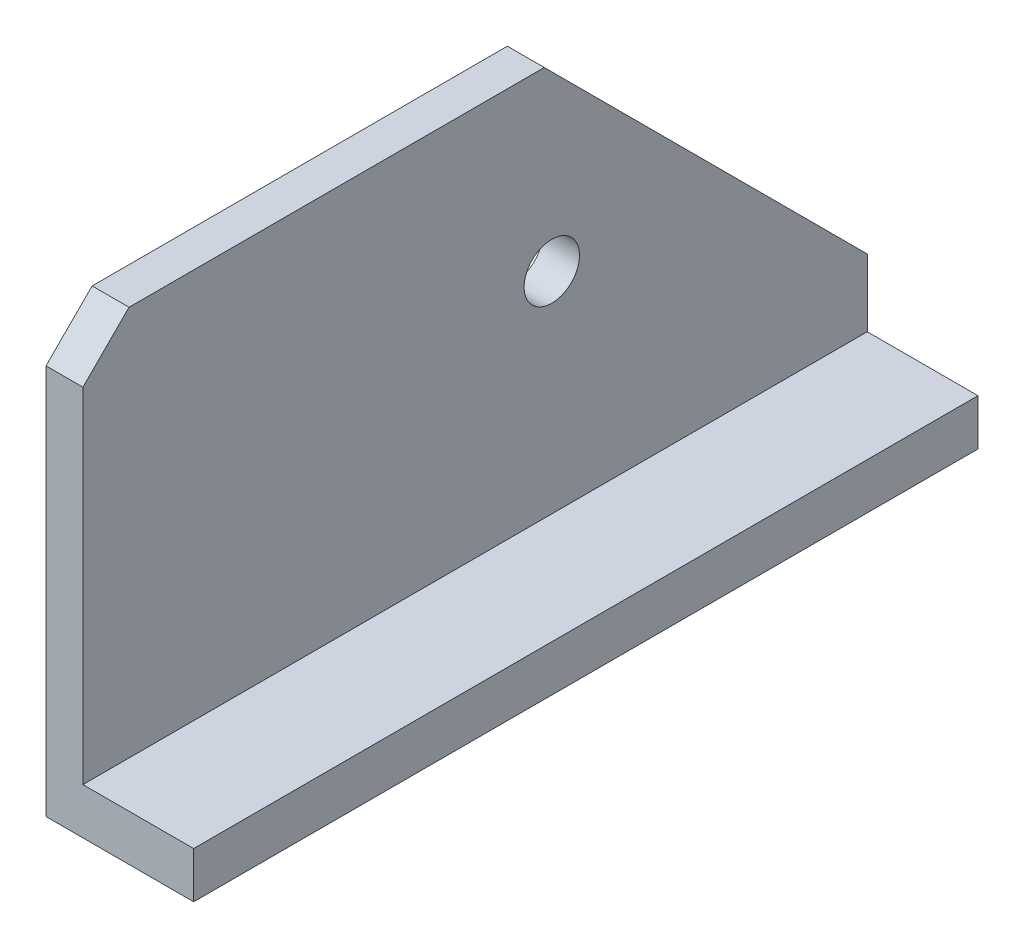
ISO-10303-21;
HEADER;
FILE_DESCRIPTION(('STEP AP214'),'2;1');
FILE_NAME('part.step','',(''),(''),'','','');
FILE_SCHEMA(('AUTOMOTIVE_DESIGN { 1 0 10303 214 1 1 1 1 }'));
ENDSEC;
DATA;
#1=APPLICATION_CONTEXT('core data for automotive mechanical design processes');
#2=APPLICATION_PROTOCOL_DEFINITION('international standard','automotive_design',2000,#1);
#3=PRODUCT_CONTEXT('',#1,'mechanical');
#4=PRODUCT('Part','Part','',(#3));
#5=PRODUCT_RELATED_PRODUCT_CATEGORY('part','',(#4));
#6=PRODUCT_DEFINITION_FORMATION('','',#4);
#7=PRODUCT_DEFINITION_CONTEXT('part definition',#1,'design');
#8=PRODUCT_DEFINITION('design','',#6,#7);
#9=PRODUCT_DEFINITION_SHAPE('','',#8);
#10=(LENGTH_UNIT() NAMED_UNIT(*) SI_UNIT(.MILLI.,.METRE.));
#11=(NAMED_UNIT(*) PLANE_ANGLE_UNIT() SI_UNIT($,.RADIAN.));
#12=(NAMED_UNIT(*) SI_UNIT($,.STERADIAN.) SOLID_ANGLE_UNIT());
#13=UNCERTAINTY_MEASURE_WITH_UNIT(LENGTH_MEASURE(1.E-05),#10,'distance_accuracy_value','');
#14=(GEOMETRIC_REPRESENTATION_CONTEXT(3) GLOBAL_UNCERTAINTY_ASSIGNED_CONTEXT((#13)) GLOBAL_UNIT_ASSIGNED_CONTEXT((#10,
#11,#12)) REPRESENTATION_CONTEXT('',''));
#15=CARTESIAN_POINT('',(0.,0.,0.));
#16=DIRECTION('',(0.,0.,1.));
#17=DIRECTION('',(1.,0.,0.));
#18=AXIS2_PLACEMENT_3D('',#15,#16,#17);
#19=CARTESIAN_POINT('',(0.,0.,85.));
#20=DIRECTION('',(-1.,0.,0.));
#21=DIRECTION('',(0.,0.,1.));
#22=AXIS2_PLACEMENT_3D('',#19,#20,#21);
#23=PLANE('',#22);
#24=CARTESIAN_POINT('',(0.,22.7734272365414,34.1865307648012));
#25=DIRECTION('',(1.,0.,0.));
#26=DIRECTION('',(0.,0.,-1.));
#27=AXIS2_PLACEMENT_3D('',#24,#25,#26);
#28=CIRCLE('',#27,2.99999999999942);
#29=CARTESIAN_POINT('',(0.,22.7734272365414,31.1865307648018));
#30=VERTEX_POINT('',#29);
#31=EDGE_CURVE('E171',#30,#30,#28,.T.);
#32=ORIENTED_EDGE('',*,*,#31,.F.);
#33=EDGE_LOOP('',(#32));
#34=FACE_BOUND('',#33,.T.);
#35=DIRECTION('',(0.,0.,-1.));
#36=VECTOR('',#35,1.);
#37=CARTESIAN_POINT('',(0.,42.3000000000002,85.));
#38=LINE('',#37,#36);
#39=CARTESIAN_POINT('',(0.,42.3000000000002,80.));
#40=VERTEX_POINT('',#39);
#41=CARTESIAN_POINT('',(0.,42.3000000000002,35.));
#42=VERTEX_POINT('',#41);
#43=EDGE_CURVE('E143',#40,#42,#38,.T.);
#44=ORIENTED_EDGE('',*,*,#43,.F.);
#45=DIRECTION('',(0.,-0.707106781186547,0.707106781186549));
#46=VECTOR('',#45,1.);
#47=CARTESIAN_POINT('',(0.,37.3000000000003,85.));
#48=LINE('',#47,#46);
#49=CARTESIAN_POINT('',(0.,37.3000000000003,85.));
#50=VERTEX_POINT('',#49);
#51=EDGE_CURVE('E11',#40,#50,#48,.T.);
#52=ORIENTED_EDGE('',*,*,#51,.T.);
#53=DIRECTION('',(0.,1.,0.));
#54=VECTOR('',#53,1.);
#55=CARTESIAN_POINT('',(0.,0.,85.));
#56=LINE('',#55,#54);
#57=CARTESIAN_POINT('',(0.,0.,85.));
#58=VERTEX_POINT('',#57);
#59=EDGE_CURVE('E102',#58,#50,#56,.T.);
#60=ORIENTED_EDGE('',*,*,#59,.F.);
#61=DIRECTION('',(0.,0.,-1.));
#62=VECTOR('',#61,1.);
#63=CARTESIAN_POINT('',(0.,0.,85.));
#64=LINE('',#63,#62);
#65=CARTESIAN_POINT('',(0.,0.,0.));
#66=VERTEX_POINT('',#65);
#67=EDGE_CURVE('E124',#58,#66,#64,.T.);
#68=ORIENTED_EDGE('',*,*,#67,.T.);
#69=DIRECTION('',(0.,1.,0.));
#70=VECTOR('',#69,1.);
#71=CARTESIAN_POINT('',(0.,0.,0.));
#72=LINE('',#71,#70);
#73=CARTESIAN_POINT('',(0.,7.30000000000015,0.));
#74=VERTEX_POINT('',#73);
#75=EDGE_CURVE('E125',#66,#74,#72,.T.);
#76=ORIENTED_EDGE('',*,*,#75,.T.);
#77=DIRECTION('',(0.,-0.707106781186548,-0.707106781186547));
#78=VECTOR('',#77,1.);
#79=CARTESIAN_POINT('',(0.,42.3000000000002,35.));
#80=LINE('',#79,#78);
#81=EDGE_CURVE('E152',#74,#42,#80,.F.);
#82=ORIENTED_EDGE('',*,*,#81,.T.);
#83=EDGE_LOOP('',(#44,#52,#60,#68,#76,#82));
#84=FACE_BOUND('',#83,.T.);
#85=ADVANCED_FACE('F31',(#34,#84),#23,.F.);
#86=CARTESIAN_POINT('',(0.,42.3000000000002,85.));
#87=DIRECTION('',(0.,-1.,0.));
#88=DIRECTION('',(0.,0.,-1.));
#89=AXIS2_PLACEMENT_3D('',#86,#87,#88);
#90=PLANE('',#89);
#91=DIRECTION('',(0.,0.,-1.));
#92=VECTOR('',#91,1.);
#93=CARTESIAN_POINT('',(-4.,42.3000000000002,85.));
#94=LINE('',#93,#92);
#95=CARTESIAN_POINT('',(-4.,42.3000000000002,80.));
#96=VERTEX_POINT('',#95);
#97=CARTESIAN_POINT('',(-4.,42.3000000000002,35.));
#98=VERTEX_POINT('',#97);
#99=EDGE_CURVE('E111',#96,#98,#94,.T.);
#100=ORIENTED_EDGE('',*,*,#99,.F.);
#101=DIRECTION('',(1.,0.,0.));
#102=VECTOR('',#101,1.);
#103=CARTESIAN_POINT('',(0.,42.3000000000002,80.));
#104=LINE('',#103,#102);
#105=EDGE_CURVE('E39',#96,#40,#104,.T.);
#106=ORIENTED_EDGE('',*,*,#105,.T.);
#107=ORIENTED_EDGE('',*,*,#43,.T.);
#108=DIRECTION('',(-1.,0.,0.));
#109=VECTOR('',#108,1.);
#110=CARTESIAN_POINT('',(0.,42.3000000000002,35.));
#111=LINE('',#110,#109);
#112=EDGE_CURVE('E145',#42,#98,#111,.T.);
#113=ORIENTED_EDGE('',*,*,#112,.T.);
#114=EDGE_LOOP('',(#100,#106,#107,#113));
#115=FACE_BOUND('',#114,.T.);
#116=ADVANCED_FACE('F165',(#115),#90,.F.);
#117=CARTESIAN_POINT('',(-4.,-5.,85.));
#118=DIRECTION('',(1.,0.,0.));
#119=DIRECTION('',(0.,0.,-1.));
#120=AXIS2_PLACEMENT_3D('',#117,#118,#119);
#121=PLANE('',#120);
#122=CARTESIAN_POINT('',(-4.,22.7734272365414,34.1865307648012));
#123=DIRECTION('',(1.,0.,0.));
#124=DIRECTION('',(0.,0.,-1.));
#125=AXIS2_PLACEMENT_3D('',#122,#123,#124);
#126=CIRCLE('',#125,2.99999999999942);
#127=CARTESIAN_POINT('',(-4.,22.7734272365414,31.1865307648018));
#128=VERTEX_POINT('',#127);
#129=EDGE_CURVE('E128',#128,#128,#126,.T.);
#130=ORIENTED_EDGE('',*,*,#129,.T.);
#131=EDGE_LOOP('',(#130));
#132=FACE_BOUND('',#131,.T.);
#133=DIRECTION('',(0.,-1.,0.));
#134=VECTOR('',#133,1.);
#135=CARTESIAN_POINT('',(-4.,-5.,85.));
#136=LINE('',#135,#134);
#137=CARTESIAN_POINT('',(-4.,37.3000000000003,85.));
#138=VERTEX_POINT('',#137);
#139=CARTESIAN_POINT('',(-4.,-5.,85.));
#140=VERTEX_POINT('',#139);
#141=EDGE_CURVE('E93',#138,#140,#136,.T.);
#142=ORIENTED_EDGE('',*,*,#141,.F.);
#143=DIRECTION('',(0.,0.707106781186547,-0.707106781186549));
#144=VECTOR('',#143,1.);
#145=CARTESIAN_POINT('',(-4.,37.3000000000003,85.));
#146=LINE('',#145,#144);
#147=EDGE_CURVE('E53',#138,#96,#146,.T.);
#148=ORIENTED_EDGE('',*,*,#147,.T.);
#149=ORIENTED_EDGE('',*,*,#99,.T.);
#150=DIRECTION('',(0.,0.707106781186548,0.707106781186547));
#151=VECTOR('',#150,1.);
#152=CARTESIAN_POINT('',(-4.,42.3000000000002,35.));
#153=LINE('',#152,#151);
#154=CARTESIAN_POINT('',(-4.,7.30000000000015,0.));
#155=VERTEX_POINT('',#154);
#156=EDGE_CURVE('E148',#98,#155,#153,.F.);
#157=ORIENTED_EDGE('',*,*,#156,.T.);
#158=DIRECTION('',(0.,-1.,0.));
#159=VECTOR('',#158,1.);
#160=CARTESIAN_POINT('',(-4.,-5.,0.));
#161=LINE('',#160,#159);
#162=CARTESIAN_POINT('',(-4.,-5.,0.));
#163=VERTEX_POINT('',#162);
#164=EDGE_CURVE('E108',#155,#163,#161,.T.);
#165=ORIENTED_EDGE('',*,*,#164,.T.);
#166=DIRECTION('',(0.,0.,-1.));
#167=VECTOR('',#166,1.);
#168=CARTESIAN_POINT('',(-4.,-5.,85.));
#169=LINE('',#168,#167);
#170=EDGE_CURVE('E105',#140,#163,#169,.T.);
#171=ORIENTED_EDGE('',*,*,#170,.F.);
#172=EDGE_LOOP('',(#142,#148,#149,#157,#165,#171));
#173=FACE_BOUND('',#172,.T.);
#174=ADVANCED_FACE('F106',(#132,#173),#121,.F.);
#175=CARTESIAN_POINT('',(-4.,-5.,85.));
#176=DIRECTION('',(0.,1.,0.));
#177=DIRECTION('',(0.,0.,1.));
#178=AXIS2_PLACEMENT_3D('',#175,#176,#177);
#179=PLANE('',#178);
#180=DIRECTION('',(1.,0.,0.));
#181=VECTOR('',#180,1.);
#182=CARTESIAN_POINT('',(-4.,-5.,0.));
#183=LINE('',#182,#181);
#184=CARTESIAN_POINT('',(12.,-5.,0.));
#185=VERTEX_POINT('',#184);
#186=EDGE_CURVE('E130',#163,#185,#183,.T.);
#187=ORIENTED_EDGE('',*,*,#186,.T.);
#188=DIRECTION('',(0.,0.,-1.));
#189=VECTOR('',#188,1.);
#190=CARTESIAN_POINT('',(12.,-5.,85.));
#191=LINE('',#190,#189);
#192=CARTESIAN_POINT('',(12.,-5.,85.));
#193=VERTEX_POINT('',#192);
#194=EDGE_CURVE('E112',#193,#185,#191,.T.);
#195=ORIENTED_EDGE('',*,*,#194,.F.);
#196=DIRECTION('',(1.,0.,0.));
#197=VECTOR('',#196,1.);
#198=CARTESIAN_POINT('',(-4.,-5.,85.));
#199=LINE('',#198,#197);
#200=EDGE_CURVE('E98',#140,#193,#199,.T.);
#201=ORIENTED_EDGE('',*,*,#200,.F.);
#202=ORIENTED_EDGE('',*,*,#170,.T.);
#203=EDGE_LOOP('',(#187,#195,#201,#202));
#204=FACE_BOUND('',#203,.T.);
#205=ADVANCED_FACE('F114',(#204),#179,.F.);
#206=CARTESIAN_POINT('',(12.,0.,85.));
#207=DIRECTION('',(-1.,0.,0.));
#208=DIRECTION('',(0.,0.,1.));
#209=AXIS2_PLACEMENT_3D('',#206,#207,#208);
#210=PLANE('',#209);
#211=DIRECTION('',(0.,1.,0.));
#212=VECTOR('',#211,1.);
#213=CARTESIAN_POINT('',(12.,0.,0.));
#214=LINE('',#213,#212);
#215=CARTESIAN_POINT('',(12.,0.,0.));
#216=VERTEX_POINT('',#215);
#217=EDGE_CURVE('E132',#185,#216,#214,.T.);
#218=ORIENTED_EDGE('',*,*,#217,.T.);
#219=DIRECTION('',(0.,0.,-1.));
#220=VECTOR('',#219,1.);
#221=CARTESIAN_POINT('',(12.,0.,85.));
#222=LINE('',#221,#220);
#223=CARTESIAN_POINT('',(12.,0.,85.));
#224=VERTEX_POINT('',#223);
#225=EDGE_CURVE('E138',#224,#216,#222,.T.);
#226=ORIENTED_EDGE('',*,*,#225,.F.);
#227=DIRECTION('',(0.,1.,0.));
#228=VECTOR('',#227,1.);
#229=CARTESIAN_POINT('',(12.,0.,85.));
#230=LINE('',#229,#228);
#231=EDGE_CURVE('E117',#193,#224,#230,.T.);
#232=ORIENTED_EDGE('',*,*,#231,.F.);
#233=ORIENTED_EDGE('',*,*,#194,.T.);
#234=EDGE_LOOP('',(#218,#226,#232,#233));
#235=FACE_BOUND('',#234,.T.);
#236=ADVANCED_FACE('F254',(#235),#210,.F.);
#237=CARTESIAN_POINT('',(0.,0.,85.));
#238=DIRECTION('',(0.,-1.,0.));
#239=DIRECTION('',(0.,0.,-1.));
#240=AXIS2_PLACEMENT_3D('',#237,#238,#239);
#241=PLANE('',#240);
#242=DIRECTION('',(-1.,0.,0.));
#243=VECTOR('',#242,1.);
#244=CARTESIAN_POINT('',(0.,0.,0.));
#245=LINE('',#244,#243);
#246=EDGE_CURVE('E134',#216,#66,#245,.T.);
#247=ORIENTED_EDGE('',*,*,#246,.T.);
#248=ORIENTED_EDGE('',*,*,#67,.F.);
#249=DIRECTION('',(-1.,0.,0.));
#250=VECTOR('',#249,1.);
#251=CARTESIAN_POINT('',(0.,0.,85.));
#252=LINE('',#251,#250);
#253=EDGE_CURVE('E119',#224,#58,#252,.T.);
#254=ORIENTED_EDGE('',*,*,#253,.F.);
#255=ORIENTED_EDGE('',*,*,#225,.T.);
#256=EDGE_LOOP('',(#247,#248,#254,#255));
#257=FACE_BOUND('',#256,.T.);
#258=ADVANCED_FACE('F208',(#257),#241,.F.);
#259=CARTESIAN_POINT('',(0.,42.3000000000002,85.));
#260=DIRECTION('',(0.,0.,1.));
#261=DIRECTION('',(1.,0.,0.));
#262=AXIS2_PLACEMENT_3D('',#259,#260,#261);
#263=PLANE('',#262);
#264=ORIENTED_EDGE('',*,*,#59,.T.);
#265=DIRECTION('',(-1.,0.,0.));
#266=VECTOR('',#265,1.);
#267=CARTESIAN_POINT('',(-4.,37.3000000000003,85.));
#268=LINE('',#267,#266);
#269=EDGE_CURVE('E101',#50,#138,#268,.T.);
#270=ORIENTED_EDGE('',*,*,#269,.T.);
#271=ORIENTED_EDGE('',*,*,#141,.T.);
#272=ORIENTED_EDGE('',*,*,#200,.T.);
#273=ORIENTED_EDGE('',*,*,#231,.T.);
#274=ORIENTED_EDGE('',*,*,#253,.T.);
#275=EDGE_LOOP('',(#264,#270,#271,#272,#273,#274));
#276=FACE_BOUND('',#275,.T.);
#277=ADVANCED_FACE('F96',(#276),#263,.T.);
#278=CARTESIAN_POINT('',(0.,42.3000000000002,0.));
#279=DIRECTION('',(0.,0.,1.));
#280=DIRECTION('',(1.,0.,0.));
#281=AXIS2_PLACEMENT_3D('',#278,#279,#280);
#282=PLANE('',#281);
#283=ORIENTED_EDGE('',*,*,#164,.F.);
#284=DIRECTION('',(1.,0.,0.));
#285=VECTOR('',#284,1.);
#286=CARTESIAN_POINT('',(0.,7.30000000000015,0.));
#287=LINE('',#286,#285);
#288=EDGE_CURVE('E150',#155,#74,#287,.T.);
#289=ORIENTED_EDGE('',*,*,#288,.T.);
#290=ORIENTED_EDGE('',*,*,#75,.F.);
#291=ORIENTED_EDGE('',*,*,#246,.F.);
#292=ORIENTED_EDGE('',*,*,#217,.F.);
#293=ORIENTED_EDGE('',*,*,#186,.F.);
#294=EDGE_LOOP('',(#283,#289,#290,#291,#292,#293));
#295=FACE_BOUND('',#294,.T.);
#296=ADVANCED_FACE('F181',(#295),#282,.F.);
#297=CARTESIAN_POINT('',(-4.,22.7734272365414,34.1865307648012));
#298=DIRECTION('',(1.,0.,0.));
#299=DIRECTION('',(0.,0.,-1.));
#300=AXIS2_PLACEMENT_3D('',#297,#298,#299);
#301=CYLINDRICAL_SURFACE('',#300,2.99999999999942);
#302=ORIENTED_EDGE('',*,*,#129,.F.);
#303=EDGE_LOOP('',(#302));
#304=FACE_BOUND('',#303,.T.);
#305=ORIENTED_EDGE('',*,*,#31,.T.);
#306=EDGE_LOOP('',(#305));
#307=FACE_BOUND('',#306,.T.);
#308=ADVANCED_FACE('F178',(#304,#307),#301,.F.);
#309=CARTESIAN_POINT('',(0.,42.3000000000002,35.));
#310=DIRECTION('',(0.,-0.707106781186547,0.707106781186548));
#311=DIRECTION('',(0.,-0.707106781186548,-0.707106781186547));
#312=AXIS2_PLACEMENT_3D('',#309,#310,#311);
#313=PLANE('',#312);
#314=ORIENTED_EDGE('',*,*,#81,.F.);
#315=ORIENTED_EDGE('',*,*,#288,.F.);
#316=ORIENTED_EDGE('',*,*,#156,.F.);
#317=ORIENTED_EDGE('',*,*,#112,.F.);
#318=EDGE_LOOP('',(#314,#315,#316,#317));
#319=FACE_BOUND('',#318,.T.);
#320=ADVANCED_FACE('F164',(#319),#313,.F.);
#321=CARTESIAN_POINT('',(0.,37.3000000000003,85.));
#322=DIRECTION('',(0.,0.707106781186548,0.707106781186546));
#323=DIRECTION('',(0.,-0.707106781186547,0.707106781186549));
#324=AXIS2_PLACEMENT_3D('',#321,#322,#323);
#325=PLANE('',#324);
#326=ORIENTED_EDGE('',*,*,#51,.F.);
#327=ORIENTED_EDGE('',*,*,#105,.F.);
#328=ORIENTED_EDGE('',*,*,#147,.F.);
#329=ORIENTED_EDGE('',*,*,#269,.F.);
#330=EDGE_LOOP('',(#326,#327,#328,#329));
#331=FACE_BOUND('',#330,.T.);
#332=ADVANCED_FACE('F33',(#331),#325,.T.);
#333=CLOSED_SHELL('',(#85,#116,#174,#205,#236,#258,#277,#296,#308,#320,#332));
#334=MANIFOLD_SOLID_BREP('B2',#333);
#335=ADVANCED_BREP_SHAPE_REPRESENTATION('',(#18,#334),#14);
#336=SHAPE_DEFINITION_REPRESENTATION(#9,#335);
ENDSEC;
END-ISO-10303-21;
